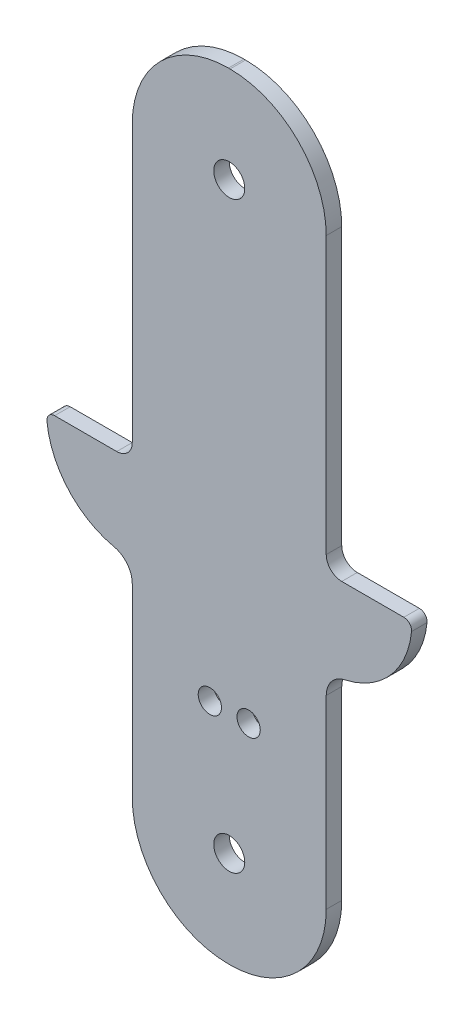
ISO-10303-21;
HEADER;
FILE_DESCRIPTION(('STEP AP214'),'2;1');
FILE_NAME('part.step','',(''),(''),'','','');
FILE_SCHEMA(('AUTOMOTIVE_DESIGN { 1 0 10303 214 1 1 1 1 }'));
ENDSEC;
DATA;
#1=APPLICATION_CONTEXT('core data for automotive mechanical design processes');
#2=APPLICATION_PROTOCOL_DEFINITION('international standard','automotive_design',2000,#1);
#3=PRODUCT_CONTEXT('',#1,'mechanical');
#4=PRODUCT('Part','Part','',(#3));
#5=PRODUCT_RELATED_PRODUCT_CATEGORY('part','',(#4));
#6=PRODUCT_DEFINITION_FORMATION('','',#4);
#7=PRODUCT_DEFINITION_CONTEXT('part definition',#1,'design');
#8=PRODUCT_DEFINITION('design','',#6,#7);
#9=PRODUCT_DEFINITION_SHAPE('','',#8);
#10=(LENGTH_UNIT() NAMED_UNIT(*) SI_UNIT(.MILLI.,.METRE.));
#11=(NAMED_UNIT(*) PLANE_ANGLE_UNIT() SI_UNIT($,.RADIAN.));
#12=(NAMED_UNIT(*) SI_UNIT($,.STERADIAN.) SOLID_ANGLE_UNIT());
#13=UNCERTAINTY_MEASURE_WITH_UNIT(LENGTH_MEASURE(1.E-05),#10,'distance_accuracy_value','');
#14=(GEOMETRIC_REPRESENTATION_CONTEXT(3) GLOBAL_UNCERTAINTY_ASSIGNED_CONTEXT((#13)) GLOBAL_UNIT_ASSIGNED_CONTEXT((#10,
#11,#12)) REPRESENTATION_CONTEXT('',''));
#15=CARTESIAN_POINT('',(0.,0.,0.));
#16=DIRECTION('',(0.,0.,1.));
#17=DIRECTION('',(1.,0.,0.));
#18=AXIS2_PLACEMENT_3D('',#15,#16,#17);
#19=CARTESIAN_POINT('',(-10.,49.,2.));
#20=DIRECTION('',(0.,0.,1.));
#21=DIRECTION('',(1.,0.,0.));
#22=AXIS2_PLACEMENT_3D('',#19,#20,#21);
#23=PLANE('',#22);
#24=CARTESIAN_POINT('',(10.,28.1534387959759,2.));
#25=DIRECTION('',(0.,0.,1.));
#26=DIRECTION('',(1.,0.,0.));
#27=AXIS2_PLACEMENT_3D('',#24,#25,#26);
#28=CIRCLE('',#27,1.5);
#29=CARTESIAN_POINT('',(11.5,28.1534387959759,2.));
#30=VERTEX_POINT('',#29);
#31=EDGE_CURVE('E394',#30,#30,#28,.T.);
#32=ORIENTED_EDGE('',*,*,#31,.F.);
#33=EDGE_LOOP('',(#32));
#34=FACE_BOUND('',#33,.T.);
#35=CARTESIAN_POINT('',(12.5,87.6,2.));
#36=DIRECTION('',(0.,0.,1.));
#37=DIRECTION('',(1.,0.,0.));
#38=AXIS2_PLACEMENT_3D('',#35,#36,#37);
#39=CIRCLE('',#38,2.);
#40=CARTESIAN_POINT('',(14.5,87.6,2.));
#41=VERTEX_POINT('',#40);
#42=EDGE_CURVE('E204',#41,#41,#39,.T.);
#43=ORIENTED_EDGE('',*,*,#42,.F.);
#44=EDGE_LOOP('',(#43));
#45=FACE_BOUND('',#44,.T.);
#46=CARTESIAN_POINT('',(-10.,49.,2.));
#47=DIRECTION('',(0.,0.,1.));
#48=DIRECTION('',(1.,0.,0.));
#49=AXIS2_PLACEMENT_3D('',#46,#47,#48);
#50=CIRCLE('',#49,1.);
#51=CARTESIAN_POINT('',(-10.,50.,2.));
#52=VERTEX_POINT('',#51);
#53=CARTESIAN_POINT('',(-10.99503719021,48.900496280979,2.));
#54=VERTEX_POINT('',#53);
#55=EDGE_CURVE('E239',#52,#54,#50,.T.);
#56=ORIENTED_EDGE('',*,*,#55,.T.);
#57=CARTESIAN_POINT('',(0.,50.,2.));
#58=DIRECTION('',(0.,0.,1.));
#59=DIRECTION('',(1.,0.,0.));
#60=AXIS2_PLACEMENT_3D('',#57,#58,#59);
#61=CIRCLE('',#60,11.0498756211209);
#62=CARTESIAN_POINT('',(-2.35942493423426,39.2049610828883,2.));
#63=VERTEX_POINT('',#62);
#64=EDGE_CURVE('E127',#54,#63,#61,.T.);
#65=ORIENTED_EDGE('',*,*,#64,.T.);
#66=CARTESIAN_POINT('',(-3.,36.2741482971377,2.));
#67=DIRECTION('',(0.,0.,-1.));
#68=DIRECTION('',(-1.,0.,0.));
#69=AXIS2_PLACEMENT_3D('',#66,#67,#68);
#70=CIRCLE('',#69,3.);
#71=CARTESIAN_POINT('',(0.,36.2741482971377,2.));
#72=VERTEX_POINT('',#71);
#73=EDGE_CURVE('E290',#63,#72,#70,.T.);
#74=ORIENTED_EDGE('',*,*,#73,.T.);
#75=DIRECTION('',(0.,-1.,0.));
#76=VECTOR('',#75,1.);
#77=CARTESIAN_POINT('',(0.,12.4000000000001,2.));
#78=LINE('',#77,#76);
#79=CARTESIAN_POINT('',(0.,12.4000000000001,2.));
#80=VERTEX_POINT('',#79);
#81=EDGE_CURVE('E309',#72,#80,#78,.T.);
#82=ORIENTED_EDGE('',*,*,#81,.T.);
#83=CARTESIAN_POINT('',(12.4,12.4,2.));
#84=DIRECTION('',(0.,0.,1.));
#85=DIRECTION('',(-1.,0.,0.));
#86=AXIS2_PLACEMENT_3D('',#83,#84,#85);
#87=CIRCLE('',#86,12.4);
#88=CARTESIAN_POINT('',(12.4000000000001,0.,2.));
#89=VERTEX_POINT('',#88);
#90=EDGE_CURVE('E306',#80,#89,#87,.T.);
#91=ORIENTED_EDGE('',*,*,#90,.T.);
#92=DIRECTION('',(1.,0.,0.));
#93=VECTOR('',#92,1.);
#94=CARTESIAN_POINT('',(12.4000000000001,0.,2.));
#95=LINE('',#94,#93);
#96=CARTESIAN_POINT('',(12.5999999999999,0.,2.));
#97=VERTEX_POINT('',#96);
#98=EDGE_CURVE('E308',#89,#97,#95,.T.);
#99=ORIENTED_EDGE('',*,*,#98,.T.);
#100=CARTESIAN_POINT('',(12.6,12.4,2.));
#101=DIRECTION('',(0.,0.,1.));
#102=DIRECTION('',(1.,0.,0.));
#103=AXIS2_PLACEMENT_3D('',#100,#101,#102);
#104=CIRCLE('',#103,12.4);
#105=CARTESIAN_POINT('',(25.,12.4000000000001,2.));
#106=VERTEX_POINT('',#105);
#107=EDGE_CURVE('E311',#97,#106,#104,.T.);
#108=ORIENTED_EDGE('',*,*,#107,.T.);
#109=DIRECTION('',(0.,1.,0.));
#110=VECTOR('',#109,1.);
#111=CARTESIAN_POINT('',(25.,12.4000000000001,2.));
#112=LINE('',#111,#110);
#113=CARTESIAN_POINT('',(25.,36.2741482971377,2.));
#114=VERTEX_POINT('',#113);
#115=EDGE_CURVE('E317',#106,#114,#112,.T.);
#116=ORIENTED_EDGE('',*,*,#115,.T.);
#117=CARTESIAN_POINT('',(28.,36.2741482971377,2.));
#118=DIRECTION('',(0.,0.,-1.));
#119=DIRECTION('',(1.,0.,0.));
#120=AXIS2_PLACEMENT_3D('',#117,#118,#119);
#121=CIRCLE('',#120,3.);
#122=CARTESIAN_POINT('',(27.3594249342343,39.2049610828883,2.));
#123=VERTEX_POINT('',#122);
#124=EDGE_CURVE('E319',#114,#123,#121,.T.);
#125=ORIENTED_EDGE('',*,*,#124,.T.);
#126=CARTESIAN_POINT('',(25.,50.,2.));
#127=DIRECTION('',(0.,0.,1.));
#128=DIRECTION('',(-1.,0.,0.));
#129=AXIS2_PLACEMENT_3D('',#126,#127,#128);
#130=CIRCLE('',#129,11.0498756211209);
#131=CARTESIAN_POINT('',(35.99503719021,48.900496280979,2.));
#132=VERTEX_POINT('',#131);
#133=EDGE_CURVE('E321',#123,#132,#130,.T.);
#134=ORIENTED_EDGE('',*,*,#133,.T.);
#135=CARTESIAN_POINT('',(35.,49.,2.));
#136=DIRECTION('',(0.,0.,1.));
#137=DIRECTION('',(-1.,0.,0.));
#138=AXIS2_PLACEMENT_3D('',#135,#136,#137);
#139=CIRCLE('',#138,1.);
#140=CARTESIAN_POINT('',(35.,50.,2.));
#141=VERTEX_POINT('',#140);
#142=EDGE_CURVE('E323',#132,#141,#139,.T.);
#143=ORIENTED_EDGE('',*,*,#142,.T.);
#144=DIRECTION('',(-1.,0.,0.));
#145=VECTOR('',#144,1.);
#146=CARTESIAN_POINT('',(27.,50.,2.));
#147=LINE('',#146,#145);
#148=CARTESIAN_POINT('',(27.,50.,2.));
#149=VERTEX_POINT('',#148);
#150=EDGE_CURVE('E325',#141,#149,#147,.T.);
#151=ORIENTED_EDGE('',*,*,#150,.T.);
#152=CARTESIAN_POINT('',(27.,52.,2.));
#153=DIRECTION('',(0.,0.,-1.));
#154=DIRECTION('',(-1.,0.,0.));
#155=AXIS2_PLACEMENT_3D('',#152,#153,#154);
#156=CIRCLE('',#155,2.);
#157=CARTESIAN_POINT('',(25.,52.,2.));
#158=VERTEX_POINT('',#157);
#159=EDGE_CURVE('E327',#149,#158,#156,.T.);
#160=ORIENTED_EDGE('',*,*,#159,.T.);
#161=DIRECTION('',(0.,1.,0.));
#162=VECTOR('',#161,1.);
#163=CARTESIAN_POINT('',(25.,52.,2.));
#164=LINE('',#163,#162);
#165=CARTESIAN_POINT('',(25.,87.5999999999999,2.));
#166=VERTEX_POINT('',#165);
#167=EDGE_CURVE('E329',#158,#166,#164,.T.);
#168=ORIENTED_EDGE('',*,*,#167,.T.);
#169=CARTESIAN_POINT('',(12.6,87.6,2.));
#170=DIRECTION('',(0.,0.,1.));
#171=DIRECTION('',(-1.,0.,0.));
#172=AXIS2_PLACEMENT_3D('',#169,#170,#171);
#173=CIRCLE('',#172,12.4);
#174=CARTESIAN_POINT('',(12.5999999999999,100.,2.));
#175=VERTEX_POINT('',#174);
#176=EDGE_CURVE('E331',#166,#175,#173,.T.);
#177=ORIENTED_EDGE('',*,*,#176,.T.);
#178=DIRECTION('',(-1.,0.,0.));
#179=VECTOR('',#178,1.);
#180=CARTESIAN_POINT('',(12.4000000000001,100.,2.));
#181=LINE('',#180,#179);
#182=CARTESIAN_POINT('',(12.4000000000001,100.,2.));
#183=VERTEX_POINT('',#182);
#184=EDGE_CURVE('E333',#175,#183,#181,.T.);
#185=ORIENTED_EDGE('',*,*,#184,.T.);
#186=CARTESIAN_POINT('',(12.4,87.6,2.));
#187=DIRECTION('',(0.,0.,1.));
#188=DIRECTION('',(-1.,0.,0.));
#189=AXIS2_PLACEMENT_3D('',#186,#187,#188);
#190=CIRCLE('',#189,12.4);
#191=CARTESIAN_POINT('',(0.,87.5999999999999,2.));
#192=VERTEX_POINT('',#191);
#193=EDGE_CURVE('E182',#183,#192,#190,.T.);
#194=ORIENTED_EDGE('',*,*,#193,.T.);
#195=DIRECTION('',(0.,-1.,0.));
#196=VECTOR('',#195,1.);
#197=CARTESIAN_POINT('',(0.,52.,2.));
#198=LINE('',#197,#196);
#199=CARTESIAN_POINT('',(0.,52.,2.));
#200=VERTEX_POINT('',#199);
#201=EDGE_CURVE('E176',#192,#200,#198,.T.);
#202=ORIENTED_EDGE('',*,*,#201,.T.);
#203=CARTESIAN_POINT('',(-2.,52.,2.));
#204=DIRECTION('',(0.,0.,-1.));
#205=DIRECTION('',(1.,0.,0.));
#206=AXIS2_PLACEMENT_3D('',#203,#204,#205);
#207=CIRCLE('',#206,2.);
#208=CARTESIAN_POINT('',(-2.00000000000001,50.,2.));
#209=VERTEX_POINT('',#208);
#210=EDGE_CURVE('E180',#200,#209,#207,.T.);
#211=ORIENTED_EDGE('',*,*,#210,.T.);
#212=DIRECTION('',(-1.,0.,0.));
#213=VECTOR('',#212,1.);
#214=CARTESIAN_POINT('',(-2.00000000000001,50.,2.));
#215=LINE('',#214,#213);
#216=EDGE_CURVE('E48',#209,#52,#215,.T.);
#217=ORIENTED_EDGE('',*,*,#216,.T.);
#218=EDGE_LOOP('',(#56,#65,#74,#82,#91,#99,#108,#116,#125,#134,#143,#151,#160,#168,#177,#185,
#194,#202,#211,#217));
#219=FACE_BOUND('',#218,.T.);
#220=CARTESIAN_POINT('',(12.5,12.4,2.));
#221=DIRECTION('',(0.,0.,1.));
#222=DIRECTION('',(1.,0.,0.));
#223=AXIS2_PLACEMENT_3D('',#220,#221,#222);
#224=CIRCLE('',#223,2.);
#225=CARTESIAN_POINT('',(14.5,12.4,2.));
#226=VERTEX_POINT('',#225);
#227=EDGE_CURVE('E400',#226,#226,#224,.T.);
#228=ORIENTED_EDGE('',*,*,#227,.F.);
#229=EDGE_LOOP('',(#228));
#230=FACE_BOUND('',#229,.T.);
#231=CARTESIAN_POINT('',(15.,28.1534387959759,2.));
#232=DIRECTION('',(0.,0.,1.));
#233=DIRECTION('',(1.,0.,0.));
#234=AXIS2_PLACEMENT_3D('',#231,#232,#233);
#235=CIRCLE('',#234,1.5);
#236=CARTESIAN_POINT('',(16.5,28.1534387959759,2.));
#237=VERTEX_POINT('',#236);
#238=EDGE_CURVE('E385',#237,#237,#235,.T.);
#239=ORIENTED_EDGE('',*,*,#238,.F.);
#240=EDGE_LOOP('',(#239));
#241=FACE_BOUND('',#240,.T.);
#242=ADVANCED_FACE('F31',(#34,#45,#219,#230,#241),#23,.T.);
#243=CARTESIAN_POINT('',(-10.,49.,0.));
#244=DIRECTION('',(0.,0.,1.));
#245=DIRECTION('',(1.,0.,0.));
#246=AXIS2_PLACEMENT_3D('',#243,#244,#245);
#247=PLANE('',#246);
#248=CARTESIAN_POINT('',(10.,28.1534387959759,0.));
#249=DIRECTION('',(0.,0.,1.));
#250=DIRECTION('',(1.,0.,0.));
#251=AXIS2_PLACEMENT_3D('',#248,#249,#250);
#252=CIRCLE('',#251,1.5);
#253=CARTESIAN_POINT('',(11.5,28.1534387959759,0.));
#254=VERTEX_POINT('',#253);
#255=EDGE_CURVE('E391',#254,#254,#252,.T.);
#256=ORIENTED_EDGE('',*,*,#255,.T.);
#257=EDGE_LOOP('',(#256));
#258=FACE_BOUND('',#257,.T.);
#259=CARTESIAN_POINT('',(12.5,87.6,0.));
#260=DIRECTION('',(0.,0.,1.));
#261=DIRECTION('',(1.,0.,0.));
#262=AXIS2_PLACEMENT_3D('',#259,#260,#261);
#263=CIRCLE('',#262,2.);
#264=CARTESIAN_POINT('',(14.5,87.6,0.));
#265=VERTEX_POINT('',#264);
#266=EDGE_CURVE('E403',#265,#265,#263,.T.);
#267=ORIENTED_EDGE('',*,*,#266,.T.);
#268=EDGE_LOOP('',(#267));
#269=FACE_BOUND('',#268,.T.);
#270=CARTESIAN_POINT('',(-10.,49.,0.));
#271=DIRECTION('',(0.,0.,1.));
#272=DIRECTION('',(1.,0.,0.));
#273=AXIS2_PLACEMENT_3D('',#270,#271,#272);
#274=CIRCLE('',#273,1.);
#275=CARTESIAN_POINT('',(-10.,50.,0.));
#276=VERTEX_POINT('',#275);
#277=CARTESIAN_POINT('',(-10.99503719021,48.900496280979,0.));
#278=VERTEX_POINT('',#277);
#279=EDGE_CURVE('E200',#276,#278,#274,.T.);
#280=ORIENTED_EDGE('',*,*,#279,.F.);
#281=DIRECTION('',(-1.,0.,0.));
#282=VECTOR('',#281,1.);
#283=CARTESIAN_POINT('',(-2.00000000000001,50.,0.));
#284=LINE('',#283,#282);
#285=CARTESIAN_POINT('',(-2.00000000000001,50.,0.));
#286=VERTEX_POINT('',#285);
#287=EDGE_CURVE('E119',#286,#276,#284,.T.);
#288=ORIENTED_EDGE('',*,*,#287,.F.);
#289=CARTESIAN_POINT('',(-2.,52.,0.));
#290=DIRECTION('',(0.,0.,-1.));
#291=DIRECTION('',(1.,0.,0.));
#292=AXIS2_PLACEMENT_3D('',#289,#290,#291);
#293=CIRCLE('',#292,2.);
#294=CARTESIAN_POINT('',(0.,52.,0.));
#295=VERTEX_POINT('',#294);
#296=EDGE_CURVE('E113',#295,#286,#293,.T.);
#297=ORIENTED_EDGE('',*,*,#296,.F.);
#298=DIRECTION('',(0.,-1.,0.));
#299=VECTOR('',#298,1.);
#300=CARTESIAN_POINT('',(0.,52.,0.));
#301=LINE('',#300,#299);
#302=CARTESIAN_POINT('',(0.,87.5999999999999,0.));
#303=VERTEX_POINT('',#302);
#304=EDGE_CURVE('E190',#303,#295,#301,.T.);
#305=ORIENTED_EDGE('',*,*,#304,.F.);
#306=CARTESIAN_POINT('',(12.4,87.6,0.));
#307=DIRECTION('',(0.,0.,1.));
#308=DIRECTION('',(-1.,0.,0.));
#309=AXIS2_PLACEMENT_3D('',#306,#307,#308);
#310=CIRCLE('',#309,12.4);
#311=CARTESIAN_POINT('',(12.4000000000001,100.,0.));
#312=VERTEX_POINT('',#311);
#313=EDGE_CURVE('E234',#312,#303,#310,.T.);
#314=ORIENTED_EDGE('',*,*,#313,.F.);
#315=DIRECTION('',(-1.,0.,0.));
#316=VECTOR('',#315,1.);
#317=CARTESIAN_POINT('',(12.4000000000001,100.,0.));
#318=LINE('',#317,#316);
#319=CARTESIAN_POINT('',(12.5999999999999,100.,0.));
#320=VERTEX_POINT('',#319);
#321=EDGE_CURVE('E232',#320,#312,#318,.T.);
#322=ORIENTED_EDGE('',*,*,#321,.F.);
#323=CARTESIAN_POINT('',(12.6,87.6,0.));
#324=DIRECTION('',(0.,0.,1.));
#325=DIRECTION('',(-1.,0.,0.));
#326=AXIS2_PLACEMENT_3D('',#323,#324,#325);
#327=CIRCLE('',#326,12.4);
#328=CARTESIAN_POINT('',(25.,87.5999999999999,0.));
#329=VERTEX_POINT('',#328);
#330=EDGE_CURVE('E230',#329,#320,#327,.T.);
#331=ORIENTED_EDGE('',*,*,#330,.F.);
#332=DIRECTION('',(0.,1.,0.));
#333=VECTOR('',#332,1.);
#334=CARTESIAN_POINT('',(25.,52.,0.));
#335=LINE('',#334,#333);
#336=CARTESIAN_POINT('',(25.,52.,0.));
#337=VERTEX_POINT('',#336);
#338=EDGE_CURVE('E228',#337,#329,#335,.T.);
#339=ORIENTED_EDGE('',*,*,#338,.F.);
#340=CARTESIAN_POINT('',(27.,52.,0.));
#341=DIRECTION('',(0.,0.,-1.));
#342=DIRECTION('',(-1.,0.,0.));
#343=AXIS2_PLACEMENT_3D('',#340,#341,#342);
#344=CIRCLE('',#343,2.);
#345=CARTESIAN_POINT('',(27.,50.,0.));
#346=VERTEX_POINT('',#345);
#347=EDGE_CURVE('E226',#346,#337,#344,.T.);
#348=ORIENTED_EDGE('',*,*,#347,.F.);
#349=DIRECTION('',(-1.,0.,0.));
#350=VECTOR('',#349,1.);
#351=CARTESIAN_POINT('',(27.,50.,0.));
#352=LINE('',#351,#350);
#353=CARTESIAN_POINT('',(35.,50.,0.));
#354=VERTEX_POINT('',#353);
#355=EDGE_CURVE('E224',#354,#346,#352,.T.);
#356=ORIENTED_EDGE('',*,*,#355,.F.);
#357=CARTESIAN_POINT('',(35.,49.,0.));
#358=DIRECTION('',(0.,0.,1.));
#359=DIRECTION('',(-1.,0.,0.));
#360=AXIS2_PLACEMENT_3D('',#357,#358,#359);
#361=CIRCLE('',#360,1.);
#362=CARTESIAN_POINT('',(35.99503719021,48.900496280979,0.));
#363=VERTEX_POINT('',#362);
#364=EDGE_CURVE('E222',#363,#354,#361,.T.);
#365=ORIENTED_EDGE('',*,*,#364,.F.);
#366=CARTESIAN_POINT('',(25.,50.,0.));
#367=DIRECTION('',(0.,0.,1.));
#368=DIRECTION('',(-1.,0.,0.));
#369=AXIS2_PLACEMENT_3D('',#366,#367,#368);
#370=CIRCLE('',#369,11.0498756211209);
#371=CARTESIAN_POINT('',(27.3594249342343,39.2049610828883,0.));
#372=VERTEX_POINT('',#371);
#373=EDGE_CURVE('E220',#372,#363,#370,.T.);
#374=ORIENTED_EDGE('',*,*,#373,.F.);
#375=CARTESIAN_POINT('',(28.,36.2741482971377,0.));
#376=DIRECTION('',(0.,0.,-1.));
#377=DIRECTION('',(1.,0.,0.));
#378=AXIS2_PLACEMENT_3D('',#375,#376,#377);
#379=CIRCLE('',#378,3.);
#380=CARTESIAN_POINT('',(25.,36.2741482971377,0.));
#381=VERTEX_POINT('',#380);
#382=EDGE_CURVE('E218',#381,#372,#379,.T.);
#383=ORIENTED_EDGE('',*,*,#382,.F.);
#384=DIRECTION('',(0.,1.,0.));
#385=VECTOR('',#384,1.);
#386=CARTESIAN_POINT('',(25.,12.4000000000001,0.));
#387=LINE('',#386,#385);
#388=CARTESIAN_POINT('',(25.,12.4000000000001,0.));
#389=VERTEX_POINT('',#388);
#390=EDGE_CURVE('E216',#389,#381,#387,.T.);
#391=ORIENTED_EDGE('',*,*,#390,.F.);
#392=CARTESIAN_POINT('',(12.6,12.4,0.));
#393=DIRECTION('',(0.,0.,1.));
#394=DIRECTION('',(1.,0.,0.));
#395=AXIS2_PLACEMENT_3D('',#392,#393,#394);
#396=CIRCLE('',#395,12.4);
#397=CARTESIAN_POINT('',(12.5999999999999,0.,0.));
#398=VERTEX_POINT('',#397);
#399=EDGE_CURVE('E214',#398,#389,#396,.T.);
#400=ORIENTED_EDGE('',*,*,#399,.F.);
#401=DIRECTION('',(1.,0.,0.));
#402=VECTOR('',#401,1.);
#403=CARTESIAN_POINT('',(12.4000000000001,0.,0.));
#404=LINE('',#403,#402);
#405=CARTESIAN_POINT('',(12.4000000000001,0.,0.));
#406=VERTEX_POINT('',#405);
#407=EDGE_CURVE('E212',#406,#398,#404,.T.);
#408=ORIENTED_EDGE('',*,*,#407,.F.);
#409=CARTESIAN_POINT('',(12.4,12.4,0.));
#410=DIRECTION('',(0.,0.,1.));
#411=DIRECTION('',(-1.,0.,0.));
#412=AXIS2_PLACEMENT_3D('',#409,#410,#411);
#413=CIRCLE('',#412,12.4);
#414=CARTESIAN_POINT('',(0.,12.4000000000001,0.));
#415=VERTEX_POINT('',#414);
#416=EDGE_CURVE('E210',#415,#406,#413,.T.);
#417=ORIENTED_EDGE('',*,*,#416,.F.);
#418=DIRECTION('',(0.,-1.,0.));
#419=VECTOR('',#418,1.);
#420=CARTESIAN_POINT('',(0.,12.4000000000001,0.));
#421=LINE('',#420,#419);
#422=CARTESIAN_POINT('',(0.,36.2741482971377,0.));
#423=VERTEX_POINT('',#422);
#424=EDGE_CURVE('E208',#423,#415,#421,.T.);
#425=ORIENTED_EDGE('',*,*,#424,.F.);
#426=CARTESIAN_POINT('',(-3.,36.2741482971377,0.));
#427=DIRECTION('',(0.,0.,-1.));
#428=DIRECTION('',(-1.,0.,0.));
#429=AXIS2_PLACEMENT_3D('',#426,#427,#428);
#430=CIRCLE('',#429,3.);
#431=CARTESIAN_POINT('',(-2.35942493423426,39.2049610828883,0.));
#432=VERTEX_POINT('',#431);
#433=EDGE_CURVE('E206',#432,#423,#430,.T.);
#434=ORIENTED_EDGE('',*,*,#433,.F.);
#435=CARTESIAN_POINT('',(0.,50.,0.));
#436=DIRECTION('',(0.,0.,1.));
#437=DIRECTION('',(1.,0.,0.));
#438=AXIS2_PLACEMENT_3D('',#435,#436,#437);
#439=CIRCLE('',#438,11.0498756211209);
#440=EDGE_CURVE('E203',#278,#432,#439,.T.);
#441=ORIENTED_EDGE('',*,*,#440,.F.);
#442=EDGE_LOOP('',(#280,#288,#297,#305,#314,#322,#331,#339,#348,#356,#365,#374,#383,#391,#400,
#408,#417,#425,#434,#441));
#443=FACE_BOUND('',#442,.T.);
#444=CARTESIAN_POINT('',(12.5,12.4,0.));
#445=DIRECTION('',(0.,0.,1.));
#446=DIRECTION('',(1.,0.,0.));
#447=AXIS2_PLACEMENT_3D('',#444,#445,#446);
#448=CIRCLE('',#447,2.);
#449=CARTESIAN_POINT('',(14.5,12.4,0.));
#450=VERTEX_POINT('',#449);
#451=EDGE_CURVE('E397',#450,#450,#448,.T.);
#452=ORIENTED_EDGE('',*,*,#451,.T.);
#453=EDGE_LOOP('',(#452));
#454=FACE_BOUND('',#453,.T.);
#455=CARTESIAN_POINT('',(15.,28.1534387959759,0.));
#456=DIRECTION('',(0.,0.,1.));
#457=DIRECTION('',(1.,0.,0.));
#458=AXIS2_PLACEMENT_3D('',#455,#456,#457);
#459=CIRCLE('',#458,1.5);
#460=CARTESIAN_POINT('',(16.5,28.1534387959759,0.));
#461=VERTEX_POINT('',#460);
#462=EDGE_CURVE('E388',#461,#461,#459,.T.);
#463=ORIENTED_EDGE('',*,*,#462,.T.);
#464=EDGE_LOOP('',(#463));
#465=FACE_BOUND('',#464,.T.);
#466=ADVANCED_FACE('F294',(#258,#269,#443,#454,#465),#247,.F.);
#467=CARTESIAN_POINT('',(-10.,49.,2.));
#468=DIRECTION('',(0.,0.,-1.));
#469=DIRECTION('',(-1.,0.,0.));
#470=AXIS2_PLACEMENT_3D('',#467,#468,#469);
#471=CYLINDRICAL_SURFACE('',#470,1.);
#472=ORIENTED_EDGE('',*,*,#279,.T.);
#473=DIRECTION('',(0.,0.,-1.));
#474=VECTOR('',#473,1.);
#475=CARTESIAN_POINT('',(-10.99503719021,48.900496280979,2.));
#476=LINE('',#475,#474);
#477=EDGE_CURVE('E11',#54,#278,#476,.T.);
#478=ORIENTED_EDGE('',*,*,#477,.F.);
#479=ORIENTED_EDGE('',*,*,#55,.F.);
#480=DIRECTION('',(0.,0.,-1.));
#481=VECTOR('',#480,1.);
#482=CARTESIAN_POINT('',(-10.,50.,2.));
#483=LINE('',#482,#481);
#484=EDGE_CURVE('E196',#52,#276,#483,.T.);
#485=ORIENTED_EDGE('',*,*,#484,.T.);
#486=EDGE_LOOP('',(#472,#478,#479,#485));
#487=FACE_BOUND('',#486,.T.);
#488=ADVANCED_FACE('F33',(#487),#471,.T.);
#489=CARTESIAN_POINT('',(0.,50.,2.));
#490=DIRECTION('',(0.,0.,-1.));
#491=DIRECTION('',(-1.,0.,0.));
#492=AXIS2_PLACEMENT_3D('',#489,#490,#491);
#493=CYLINDRICAL_SURFACE('',#492,11.0498756211209);
#494=ORIENTED_EDGE('',*,*,#440,.T.);
#495=DIRECTION('',(0.,0.,-1.));
#496=VECTOR('',#495,1.);
#497=CARTESIAN_POINT('',(-2.35942493423426,39.2049610828883,2.));
#498=LINE('',#497,#496);
#499=EDGE_CURVE('E40',#63,#432,#498,.T.);
#500=ORIENTED_EDGE('',*,*,#499,.F.);
#501=ORIENTED_EDGE('',*,*,#64,.F.);
#502=ORIENTED_EDGE('',*,*,#477,.T.);
#503=EDGE_LOOP('',(#494,#500,#501,#502));
#504=FACE_BOUND('',#503,.T.);
#505=ADVANCED_FACE('F592',(#504),#493,.T.);
#506=CARTESIAN_POINT('',(-3.,36.2741482971377,2.));
#507=DIRECTION('',(0.,0.,-1.));
#508=DIRECTION('',(-1.,0.,0.));
#509=AXIS2_PLACEMENT_3D('',#506,#507,#508);
#510=CYLINDRICAL_SURFACE('',#509,3.);
#511=ORIENTED_EDGE('',*,*,#433,.T.);
#512=DIRECTION('',(0.,0.,-1.));
#513=VECTOR('',#512,1.);
#514=CARTESIAN_POINT('',(0.,36.2741482971377,2.));
#515=LINE('',#514,#513);
#516=EDGE_CURVE('E282',#72,#423,#515,.T.);
#517=ORIENTED_EDGE('',*,*,#516,.F.);
#518=ORIENTED_EDGE('',*,*,#73,.F.);
#519=ORIENTED_EDGE('',*,*,#499,.T.);
#520=EDGE_LOOP('',(#511,#517,#518,#519));
#521=FACE_BOUND('',#520,.T.);
#522=ADVANCED_FACE('F288',(#521),#510,.F.);
#523=CARTESIAN_POINT('',(0.,12.4000000000001,2.));
#524=DIRECTION('',(1.,0.,0.));
#525=DIRECTION('',(0.,1.,0.));
#526=AXIS2_PLACEMENT_3D('',#523,#524,#525);
#527=PLANE('',#526);
#528=ORIENTED_EDGE('',*,*,#424,.T.);
#529=DIRECTION('',(0.,0.,-1.));
#530=VECTOR('',#529,1.);
#531=CARTESIAN_POINT('',(0.,12.4000000000001,2.));
#532=LINE('',#531,#530);
#533=EDGE_CURVE('E279',#80,#415,#532,.T.);
#534=ORIENTED_EDGE('',*,*,#533,.F.);
#535=ORIENTED_EDGE('',*,*,#81,.F.);
#536=ORIENTED_EDGE('',*,*,#516,.T.);
#537=EDGE_LOOP('',(#528,#534,#535,#536));
#538=FACE_BOUND('',#537,.T.);
#539=ADVANCED_FACE('F300',(#538),#527,.F.);
#540=CARTESIAN_POINT('',(12.4,12.4,2.));
#541=DIRECTION('',(0.,0.,-1.));
#542=DIRECTION('',(-1.,0.,0.));
#543=AXIS2_PLACEMENT_3D('',#540,#541,#542);
#544=CYLINDRICAL_SURFACE('',#543,12.4);
#545=ORIENTED_EDGE('',*,*,#416,.T.);
#546=DIRECTION('',(0.,0.,-1.));
#547=VECTOR('',#546,1.);
#548=CARTESIAN_POINT('',(12.4000000000001,0.,2.));
#549=LINE('',#548,#547);
#550=EDGE_CURVE('E276',#89,#406,#549,.T.);
#551=ORIENTED_EDGE('',*,*,#550,.F.);
#552=ORIENTED_EDGE('',*,*,#90,.F.);
#553=ORIENTED_EDGE('',*,*,#533,.T.);
#554=EDGE_LOOP('',(#545,#551,#552,#553));
#555=FACE_BOUND('',#554,.T.);
#556=ADVANCED_FACE('F304',(#555),#544,.T.);
#557=CARTESIAN_POINT('',(12.4000000000001,0.,2.));
#558=DIRECTION('',(0.,1.,0.));
#559=DIRECTION('',(0.,0.,1.));
#560=AXIS2_PLACEMENT_3D('',#557,#558,#559);
#561=PLANE('',#560);
#562=ORIENTED_EDGE('',*,*,#407,.T.);
#563=DIRECTION('',(0.,0.,-1.));
#564=VECTOR('',#563,1.);
#565=CARTESIAN_POINT('',(12.5999999999999,0.,2.));
#566=LINE('',#565,#564);
#567=EDGE_CURVE('E273',#97,#398,#566,.T.);
#568=ORIENTED_EDGE('',*,*,#567,.F.);
#569=ORIENTED_EDGE('',*,*,#98,.F.);
#570=ORIENTED_EDGE('',*,*,#550,.T.);
#571=EDGE_LOOP('',(#562,#568,#569,#570));
#572=FACE_BOUND('',#571,.T.);
#573=ADVANCED_FACE('F557',(#572),#561,.F.);
#574=CARTESIAN_POINT('',(12.6,12.4,2.));
#575=DIRECTION('',(0.,0.,-1.));
#576=DIRECTION('',(-1.,0.,0.));
#577=AXIS2_PLACEMENT_3D('',#574,#575,#576);
#578=CYLINDRICAL_SURFACE('',#577,12.4);
#579=ORIENTED_EDGE('',*,*,#399,.T.);
#580=DIRECTION('',(0.,0.,-1.));
#581=VECTOR('',#580,1.);
#582=CARTESIAN_POINT('',(25.,12.4000000000001,2.));
#583=LINE('',#582,#581);
#584=EDGE_CURVE('E270',#106,#389,#583,.T.);
#585=ORIENTED_EDGE('',*,*,#584,.F.);
#586=ORIENTED_EDGE('',*,*,#107,.F.);
#587=ORIENTED_EDGE('',*,*,#567,.T.);
#588=EDGE_LOOP('',(#579,#585,#586,#587));
#589=FACE_BOUND('',#588,.T.);
#590=ADVANCED_FACE('F547',(#589),#578,.T.);
#591=CARTESIAN_POINT('',(25.,12.4000000000001,2.));
#592=DIRECTION('',(-1.,0.,0.));
#593=DIRECTION('',(0.,0.,1.));
#594=AXIS2_PLACEMENT_3D('',#591,#592,#593);
#595=PLANE('',#594);
#596=ORIENTED_EDGE('',*,*,#390,.T.);
#597=DIRECTION('',(0.,0.,-1.));
#598=VECTOR('',#597,1.);
#599=CARTESIAN_POINT('',(25.,36.2741482971377,2.));
#600=LINE('',#599,#598);
#601=EDGE_CURVE('E267',#114,#381,#600,.T.);
#602=ORIENTED_EDGE('',*,*,#601,.F.);
#603=ORIENTED_EDGE('',*,*,#115,.F.);
#604=ORIENTED_EDGE('',*,*,#584,.T.);
#605=EDGE_LOOP('',(#596,#602,#603,#604));
#606=FACE_BOUND('',#605,.T.);
#607=ADVANCED_FACE('F537',(#606),#595,.F.);
#608=CARTESIAN_POINT('',(28.,36.2741482971377,2.));
#609=DIRECTION('',(0.,0.,-1.));
#610=DIRECTION('',(-1.,0.,0.));
#611=AXIS2_PLACEMENT_3D('',#608,#609,#610);
#612=CYLINDRICAL_SURFACE('',#611,3.);
#613=ORIENTED_EDGE('',*,*,#382,.T.);
#614=DIRECTION('',(0.,0.,-1.));
#615=VECTOR('',#614,1.);
#616=CARTESIAN_POINT('',(27.3594249342343,39.2049610828883,2.));
#617=LINE('',#616,#615);
#618=EDGE_CURVE('E264',#123,#372,#617,.T.);
#619=ORIENTED_EDGE('',*,*,#618,.F.);
#620=ORIENTED_EDGE('',*,*,#124,.F.);
#621=ORIENTED_EDGE('',*,*,#601,.T.);
#622=EDGE_LOOP('',(#613,#619,#620,#621));
#623=FACE_BOUND('',#622,.T.);
#624=ADVANCED_FACE('F527',(#623),#612,.F.);
#625=CARTESIAN_POINT('',(25.,50.,2.));
#626=DIRECTION('',(0.,0.,-1.));
#627=DIRECTION('',(-1.,0.,0.));
#628=AXIS2_PLACEMENT_3D('',#625,#626,#627);
#629=CYLINDRICAL_SURFACE('',#628,11.0498756211209);
#630=ORIENTED_EDGE('',*,*,#373,.T.);
#631=DIRECTION('',(0.,0.,-1.));
#632=VECTOR('',#631,1.);
#633=CARTESIAN_POINT('',(35.99503719021,48.900496280979,2.));
#634=LINE('',#633,#632);
#635=EDGE_CURVE('E261',#132,#363,#634,.T.);
#636=ORIENTED_EDGE('',*,*,#635,.F.);
#637=ORIENTED_EDGE('',*,*,#133,.F.);
#638=ORIENTED_EDGE('',*,*,#618,.T.);
#639=EDGE_LOOP('',(#630,#636,#637,#638));
#640=FACE_BOUND('',#639,.T.);
#641=ADVANCED_FACE('F517',(#640),#629,.T.);
#642=CARTESIAN_POINT('',(35.,49.,2.));
#643=DIRECTION('',(0.,0.,-1.));
#644=DIRECTION('',(-1.,0.,0.));
#645=AXIS2_PLACEMENT_3D('',#642,#643,#644);
#646=CYLINDRICAL_SURFACE('',#645,1.);
#647=ORIENTED_EDGE('',*,*,#364,.T.);
#648=DIRECTION('',(0.,0.,-1.));
#649=VECTOR('',#648,1.);
#650=CARTESIAN_POINT('',(35.,50.,2.));
#651=LINE('',#650,#649);
#652=EDGE_CURVE('E258',#141,#354,#651,.T.);
#653=ORIENTED_EDGE('',*,*,#652,.F.);
#654=ORIENTED_EDGE('',*,*,#142,.F.);
#655=ORIENTED_EDGE('',*,*,#635,.T.);
#656=EDGE_LOOP('',(#647,#653,#654,#655));
#657=FACE_BOUND('',#656,.T.);
#658=ADVANCED_FACE('F507',(#657),#646,.T.);
#659=CARTESIAN_POINT('',(27.,50.,2.));
#660=DIRECTION('',(0.,-1.,0.));
#661=DIRECTION('',(0.,0.,-1.));
#662=AXIS2_PLACEMENT_3D('',#659,#660,#661);
#663=PLANE('',#662);
#664=ORIENTED_EDGE('',*,*,#355,.T.);
#665=DIRECTION('',(0.,0.,-1.));
#666=VECTOR('',#665,1.);
#667=CARTESIAN_POINT('',(27.,50.,2.));
#668=LINE('',#667,#666);
#669=EDGE_CURVE('E255',#149,#346,#668,.T.);
#670=ORIENTED_EDGE('',*,*,#669,.F.);
#671=ORIENTED_EDGE('',*,*,#150,.F.);
#672=ORIENTED_EDGE('',*,*,#652,.T.);
#673=EDGE_LOOP('',(#664,#670,#671,#672));
#674=FACE_BOUND('',#673,.T.);
#675=ADVANCED_FACE('F497',(#674),#663,.F.);
#676=CARTESIAN_POINT('',(27.,52.,2.));
#677=DIRECTION('',(0.,0.,-1.));
#678=DIRECTION('',(-1.,0.,0.));
#679=AXIS2_PLACEMENT_3D('',#676,#677,#678);
#680=CYLINDRICAL_SURFACE('',#679,2.);
#681=ORIENTED_EDGE('',*,*,#347,.T.);
#682=DIRECTION('',(0.,0.,-1.));
#683=VECTOR('',#682,1.);
#684=CARTESIAN_POINT('',(25.,52.,2.));
#685=LINE('',#684,#683);
#686=EDGE_CURVE('E252',#158,#337,#685,.T.);
#687=ORIENTED_EDGE('',*,*,#686,.F.);
#688=ORIENTED_EDGE('',*,*,#159,.F.);
#689=ORIENTED_EDGE('',*,*,#669,.T.);
#690=EDGE_LOOP('',(#681,#687,#688,#689));
#691=FACE_BOUND('',#690,.T.);
#692=ADVANCED_FACE('F487',(#691),#680,.F.);
#693=CARTESIAN_POINT('',(25.,52.,2.));
#694=DIRECTION('',(-1.,0.,0.));
#695=DIRECTION('',(0.,-1.,0.));
#696=AXIS2_PLACEMENT_3D('',#693,#694,#695);
#697=PLANE('',#696);
#698=ORIENTED_EDGE('',*,*,#338,.T.);
#699=DIRECTION('',(0.,0.,-1.));
#700=VECTOR('',#699,1.);
#701=CARTESIAN_POINT('',(25.,87.5999999999999,2.));
#702=LINE('',#701,#700);
#703=EDGE_CURVE('E249',#166,#329,#702,.T.);
#704=ORIENTED_EDGE('',*,*,#703,.F.);
#705=ORIENTED_EDGE('',*,*,#167,.F.);
#706=ORIENTED_EDGE('',*,*,#686,.T.);
#707=EDGE_LOOP('',(#698,#704,#705,#706));
#708=FACE_BOUND('',#707,.T.);
#709=ADVANCED_FACE('F477',(#708),#697,.F.);
#710=CARTESIAN_POINT('',(12.6,87.6,2.));
#711=DIRECTION('',(0.,0.,-1.));
#712=DIRECTION('',(-1.,0.,0.));
#713=AXIS2_PLACEMENT_3D('',#710,#711,#712);
#714=CYLINDRICAL_SURFACE('',#713,12.4);
#715=ORIENTED_EDGE('',*,*,#330,.T.);
#716=DIRECTION('',(0.,0.,-1.));
#717=VECTOR('',#716,1.);
#718=CARTESIAN_POINT('',(12.5999999999999,100.,2.));
#719=LINE('',#718,#717);
#720=EDGE_CURVE('E246',#175,#320,#719,.T.);
#721=ORIENTED_EDGE('',*,*,#720,.F.);
#722=ORIENTED_EDGE('',*,*,#176,.F.);
#723=ORIENTED_EDGE('',*,*,#703,.T.);
#724=EDGE_LOOP('',(#715,#721,#722,#723));
#725=FACE_BOUND('',#724,.T.);
#726=ADVANCED_FACE('F468',(#725),#714,.T.);
#727=CARTESIAN_POINT('',(12.4000000000001,100.,2.));
#728=DIRECTION('',(0.,-1.,0.));
#729=DIRECTION('',(0.,0.,-1.));
#730=AXIS2_PLACEMENT_3D('',#727,#728,#729);
#731=PLANE('',#730);
#732=ORIENTED_EDGE('',*,*,#321,.T.);
#733=DIRECTION('',(0.,0.,-1.));
#734=VECTOR('',#733,1.);
#735=CARTESIAN_POINT('',(12.4000000000001,100.,2.));
#736=LINE('',#735,#734);
#737=EDGE_CURVE('E243',#183,#312,#736,.T.);
#738=ORIENTED_EDGE('',*,*,#737,.F.);
#739=ORIENTED_EDGE('',*,*,#184,.F.);
#740=ORIENTED_EDGE('',*,*,#720,.T.);
#741=EDGE_LOOP('',(#732,#738,#739,#740));
#742=FACE_BOUND('',#741,.T.);
#743=ADVANCED_FACE('F339',(#742),#731,.F.);
#744=CARTESIAN_POINT('',(12.4,87.6,2.));
#745=DIRECTION('',(0.,0.,-1.));
#746=DIRECTION('',(-1.,0.,0.));
#747=AXIS2_PLACEMENT_3D('',#744,#745,#746);
#748=CYLINDRICAL_SURFACE('',#747,12.4);
#749=ORIENTED_EDGE('',*,*,#313,.T.);
#750=DIRECTION('',(0.,0.,-1.));
#751=VECTOR('',#750,1.);
#752=CARTESIAN_POINT('',(0.,87.5999999999999,2.));
#753=LINE('',#752,#751);
#754=EDGE_CURVE('E191',#192,#303,#753,.T.);
#755=ORIENTED_EDGE('',*,*,#754,.F.);
#756=ORIENTED_EDGE('',*,*,#193,.F.);
#757=ORIENTED_EDGE('',*,*,#737,.T.);
#758=EDGE_LOOP('',(#749,#755,#756,#757));
#759=FACE_BOUND('',#758,.T.);
#760=ADVANCED_FACE('F343',(#759),#748,.T.);
#761=CARTESIAN_POINT('',(0.,52.,2.));
#762=DIRECTION('',(1.,0.,0.));
#763=DIRECTION('',(0.,0.,-1.));
#764=AXIS2_PLACEMENT_3D('',#761,#762,#763);
#765=PLANE('',#764);
#766=ORIENTED_EDGE('',*,*,#304,.T.);
#767=DIRECTION('',(0.,0.,-1.));
#768=VECTOR('',#767,1.);
#769=CARTESIAN_POINT('',(0.,52.,2.));
#770=LINE('',#769,#768);
#771=EDGE_CURVE('E187',#200,#295,#770,.T.);
#772=ORIENTED_EDGE('',*,*,#771,.F.);
#773=ORIENTED_EDGE('',*,*,#201,.F.);
#774=ORIENTED_EDGE('',*,*,#754,.T.);
#775=EDGE_LOOP('',(#766,#772,#773,#774));
#776=FACE_BOUND('',#775,.T.);
#777=ADVANCED_FACE('F188',(#776),#765,.F.);
#778=CARTESIAN_POINT('',(-2.,52.,2.));
#779=DIRECTION('',(0.,0.,-1.));
#780=DIRECTION('',(-1.,0.,0.));
#781=AXIS2_PLACEMENT_3D('',#778,#779,#780);
#782=CYLINDRICAL_SURFACE('',#781,2.);
#783=ORIENTED_EDGE('',*,*,#296,.T.);
#784=DIRECTION('',(0.,0.,-1.));
#785=VECTOR('',#784,1.);
#786=CARTESIAN_POINT('',(-2.00000000000001,50.,2.));
#787=LINE('',#786,#785);
#788=EDGE_CURVE('E192',#209,#286,#787,.T.);
#789=ORIENTED_EDGE('',*,*,#788,.F.);
#790=ORIENTED_EDGE('',*,*,#210,.F.);
#791=ORIENTED_EDGE('',*,*,#771,.T.);
#792=EDGE_LOOP('',(#783,#789,#790,#791));
#793=FACE_BOUND('',#792,.T.);
#794=ADVANCED_FACE('F194',(#793),#782,.F.);
#795=CARTESIAN_POINT('',(-2.00000000000001,50.,2.));
#796=DIRECTION('',(0.,-1.,0.));
#797=DIRECTION('',(0.,0.,-1.));
#798=AXIS2_PLACEMENT_3D('',#795,#796,#797);
#799=PLANE('',#798);
#800=ORIENTED_EDGE('',*,*,#287,.T.);
#801=ORIENTED_EDGE('',*,*,#484,.F.);
#802=ORIENTED_EDGE('',*,*,#216,.F.);
#803=ORIENTED_EDGE('',*,*,#788,.T.);
#804=EDGE_LOOP('',(#800,#801,#802,#803));
#805=FACE_BOUND('',#804,.T.);
#806=ADVANCED_FACE('F347',(#805),#799,.F.);
#807=CARTESIAN_POINT('',(12.5,87.6,2.));
#808=DIRECTION('',(0.,0.,-1.));
#809=DIRECTION('',(-1.,0.,0.));
#810=AXIS2_PLACEMENT_3D('',#807,#808,#809);
#811=CYLINDRICAL_SURFACE('',#810,2.);
#812=ORIENTED_EDGE('',*,*,#42,.T.);
#813=EDGE_LOOP('',(#812));
#814=FACE_BOUND('',#813,.T.);
#815=ORIENTED_EDGE('',*,*,#266,.F.);
#816=EDGE_LOOP('',(#815));
#817=FACE_BOUND('',#816,.T.);
#818=ADVANCED_FACE('F349',(#814,#817),#811,.F.);
#819=CARTESIAN_POINT('',(12.5,12.4,2.));
#820=DIRECTION('',(0.,0.,-1.));
#821=DIRECTION('',(-1.,0.,0.));
#822=AXIS2_PLACEMENT_3D('',#819,#820,#821);
#823=CYLINDRICAL_SURFACE('',#822,2.);
#824=ORIENTED_EDGE('',*,*,#227,.T.);
#825=EDGE_LOOP('',(#824));
#826=FACE_BOUND('',#825,.T.);
#827=ORIENTED_EDGE('',*,*,#451,.F.);
#828=EDGE_LOOP('',(#827));
#829=FACE_BOUND('',#828,.T.);
#830=ADVANCED_FACE('F355',(#826,#829),#823,.F.);
#831=CARTESIAN_POINT('',(10.,28.1534387959759,2.));
#832=DIRECTION('',(0.,0.,-1.));
#833=DIRECTION('',(-1.,0.,0.));
#834=AXIS2_PLACEMENT_3D('',#831,#832,#833);
#835=CYLINDRICAL_SURFACE('',#834,1.5);
#836=ORIENTED_EDGE('',*,*,#31,.T.);
#837=EDGE_LOOP('',(#836));
#838=FACE_BOUND('',#837,.T.);
#839=ORIENTED_EDGE('',*,*,#255,.F.);
#840=EDGE_LOOP('',(#839));
#841=FACE_BOUND('',#840,.T.);
#842=ADVANCED_FACE('F372',(#838,#841),#835,.F.);
#843=CARTESIAN_POINT('',(15.,28.1534387959759,2.));
#844=DIRECTION('',(0.,0.,-1.));
#845=DIRECTION('',(-1.,0.,0.));
#846=AXIS2_PLACEMENT_3D('',#843,#844,#845);
#847=CYLINDRICAL_SURFACE('',#846,1.5);
#848=ORIENTED_EDGE('',*,*,#238,.T.);
#849=EDGE_LOOP('',(#848));
#850=FACE_BOUND('',#849,.T.);
#851=ORIENTED_EDGE('',*,*,#462,.F.);
#852=EDGE_LOOP('',(#851));
#853=FACE_BOUND('',#852,.T.);
#854=ADVANCED_FACE('F376',(#850,#853),#847,.F.);
#855=CLOSED_SHELL('',(#242,#466,#488,#505,#522,#539,#556,#573,#590,#607,#624,#641,#658,#675,
#692,#709,#726,#743,#760,#777,#794,#806,#818,#830,#842,#854));
#856=MANIFOLD_SOLID_BREP('B2',#855);
#857=ADVANCED_BREP_SHAPE_REPRESENTATION('',(#18,#856),#14);
#858=SHAPE_DEFINITION_REPRESENTATION(#9,#857);
ENDSEC;
END-ISO-10303-21;
